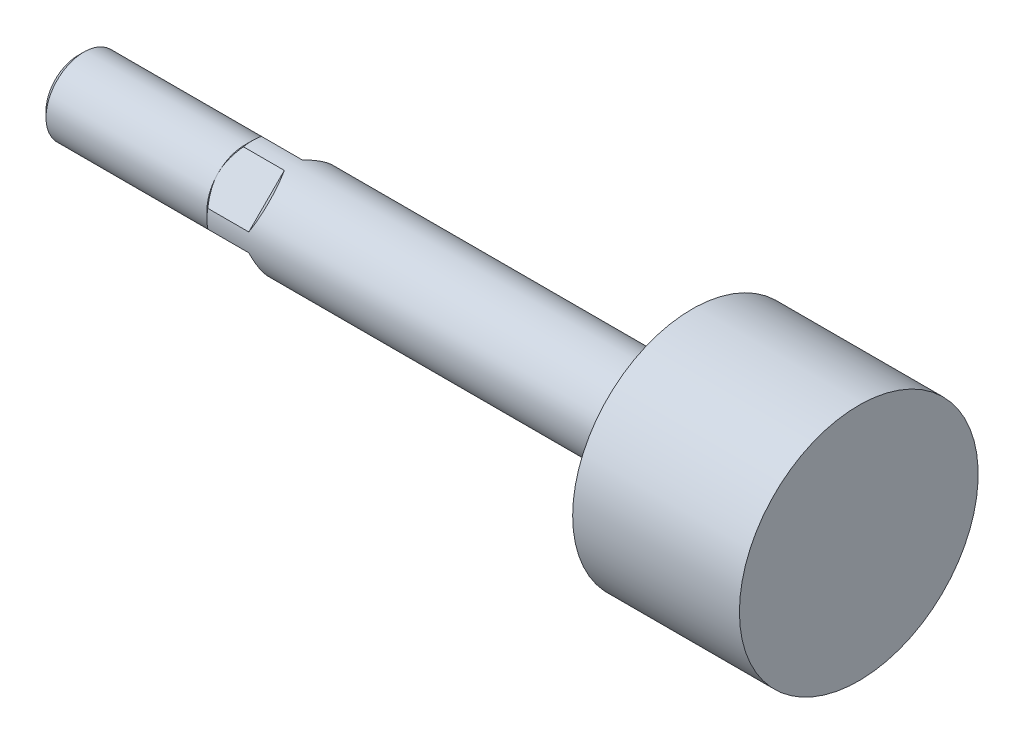
ISO-10303-21;
HEADER;
FILE_DESCRIPTION(('STEP AP214'),'2;1');
FILE_NAME('part.step','',(''),(''),'','','');
FILE_SCHEMA(('AUTOMOTIVE_DESIGN { 1 0 10303 214 1 1 1 1 }'));
ENDSEC;
DATA;
#1=APPLICATION_CONTEXT('core data for automotive mechanical design processes');
#2=APPLICATION_PROTOCOL_DEFINITION('international standard','automotive_design',2000,#1);
#3=PRODUCT_CONTEXT('',#1,'mechanical');
#4=PRODUCT('Part','Part','',(#3));
#5=PRODUCT_RELATED_PRODUCT_CATEGORY('part','',(#4));
#6=PRODUCT_DEFINITION_FORMATION('','',#4);
#7=PRODUCT_DEFINITION_CONTEXT('part definition',#1,'design');
#8=PRODUCT_DEFINITION('design','',#6,#7);
#9=PRODUCT_DEFINITION_SHAPE('','',#8);
#10=(LENGTH_UNIT() NAMED_UNIT(*) SI_UNIT(.MILLI.,.METRE.));
#11=(NAMED_UNIT(*) PLANE_ANGLE_UNIT() SI_UNIT($,.RADIAN.));
#12=(NAMED_UNIT(*) SI_UNIT($,.STERADIAN.) SOLID_ANGLE_UNIT());
#13=UNCERTAINTY_MEASURE_WITH_UNIT(LENGTH_MEASURE(1.E-05),#10,'distance_accuracy_value','');
#14=(GEOMETRIC_REPRESENTATION_CONTEXT(3) GLOBAL_UNCERTAINTY_ASSIGNED_CONTEXT((#13)) GLOBAL_UNIT_ASSIGNED_CONTEXT((#10,
#11,#12)) REPRESENTATION_CONTEXT('',''));
#15=CARTESIAN_POINT('',(0.,0.,0.));
#16=DIRECTION('',(0.,0.,1.));
#17=DIRECTION('',(1.,0.,0.));
#18=AXIS2_PLACEMENT_3D('',#15,#16,#17);
#19=CARTESIAN_POINT('',(23.,0.,0.));
#20=DIRECTION('',(1.,0.,0.));
#21=DIRECTION('',(0.,0.,-1.));
#22=AXIS2_PLACEMENT_3D('',#19,#20,#21);
#23=CONICAL_SURFACE('',#22,5.99999999999999,0.785398163397458);
#24=CARTESIAN_POINT('',(23.,0.,0.));
#25=DIRECTION('',(-1.,0.,0.));
#26=DIRECTION('',(0.,0.,1.));
#27=AXIS2_PLACEMENT_3D('',#24,#25,#26);
#28=CIRCLE('',#27,5.99999999999999);
#29=CARTESIAN_POINT('',(23.,-5.88074178584445,-1.19032602602103));
#30=VERTEX_POINT('',#29);
#31=CARTESIAN_POINT('',(23.,-5.88074178584444,1.19032602602103));
#32=VERTEX_POINT('',#31);
#33=EDGE_CURVE('E207',#30,#32,#28,.T.);
#34=ORIENTED_EDGE('',*,*,#33,.T.);
#35=CARTESIAN_POINT('',(23.0002,-5.88099761701418,1.19007019485129));
#36=CARTESIAN_POINT('',(22.9510440724068,-5.81811483877079,1.25295297309469));
#37=CARTESIAN_POINT('',(22.9029313524006,-5.75482507418753,1.31624273767794));
#38=CARTESIAN_POINT('',(22.8090823894487,-5.62734850641512,1.44371930545036));
#39=CARTESIAN_POINT('',(22.7633468355185,-5.56316144991377,1.5079063619517));
#40=CARTESIAN_POINT('',(22.6298425181198,-5.36868839423571,1.70237941762976));
#41=CARTESIAN_POINT('',(22.5461580251507,-5.23697199461111,1.83409581725437));
#42=CARTESIAN_POINT('',(22.3921031533509,-4.96822727016497,2.10284054170051));
#43=CARTESIAN_POINT('',(22.3218635701848,-4.83116098734402,2.23990682452145));
#44=CARTESIAN_POINT('',(22.1996463430324,-4.55314819356123,2.51791961830425));
#45=CARTESIAN_POINT('',(22.1476398226633,-4.41220820286015,2.65885960900533));
#46=CARTESIAN_POINT('',(22.076734746217,-4.16562053549284,2.90544727637264));
#47=CARTESIAN_POINT('',(22.0526890191447,-4.06071275132042,3.01035506054505));
#48=CARTESIAN_POINT('',(22.0175298585743,-3.84979184907852,3.22127596278696));
#49=CARTESIAN_POINT('',(22.0064169654416,-3.74377868501026,3.32728912685522));
#50=CARTESIAN_POINT('',(21.9977783521526,-3.53213647013348,3.53893134173199));
#51=CARTESIAN_POINT('',(22.0001680259723,-3.42650916818225,3.64455864368323));
#52=CARTESIAN_POINT('',(22.0181960610271,-3.21582855252728,3.8552392593382));
#53=CARTESIAN_POINT('',(22.0338352417217,-3.11077527473044,3.96029253713504));
#54=CARTESIAN_POINT('',(22.0830231598923,-2.87582236565571,4.19524544620977));
#55=CARTESIAN_POINT('',(22.1200764012196,-2.74628952530564,4.32477828655983));
#56=CARTESIAN_POINT('',(22.2110065453868,-2.49021090718472,4.58085690468076));
#57=CARTESIAN_POINT('',(22.2648923193015,-2.36366674241754,4.70740106944794));
#58=CARTESIAN_POINT('',(22.3867857329961,-2.11334572452877,4.9577220873367));
#59=CARTESIAN_POINT('',(22.454864970523,-1.98958656921088,5.0814812426546));
#60=CARTESIAN_POINT('',(22.6021483972449,-1.7454997819655,5.32556802989997));
#61=CARTESIAN_POINT('',(22.6813495208956,-1.6251712154168,5.44589659644868));
#62=CARTESIAN_POINT('',(22.8025857634106,-1.45295236100177,5.6181154508637));
#63=CARTESIAN_POINT('',(22.8411147424625,-1.39980646766205,5.67126134420343));
#64=CARTESIAN_POINT('',(22.9195954983845,-1.29437286498686,5.77669494687861));
#65=CARTESIAN_POINT('',(22.9595394195067,-1.24208223430453,5.82898557756095));
#66=CARTESIAN_POINT('',(23.0002,-1.19007019485129,5.88099761701419));
#67=B_SPLINE_CURVE_WITH_KNOTS('',3,(#35,#36,#37,#38,#39,#40,#41,#42,#43,#44,#45,#46,#47,#48,#49,
#50,#51,#52,#53,#54,#55,#56,#57,#58,#59,#60,#61,#62,#63,#64,#65,#66),.UNSPECIFIED.,.F.,.F.,(4,2,
2,2,2,2,2,2,2,2,2,2,2,2,2,4),(0.,0.304819578685166,0.609727021412003,1.22188083188484,
1.83971682595722,2.45656986235398,2.90695888785135,3.357366731032,3.80495549641768,
4.25257194643119,4.81229509723291,5.37231373221722,5.9352288198634,6.49798905371385,
6.75135396448936,7.0034831658224),.UNSPECIFIED.);
#68=CARTESIAN_POINT('',(22.,-3.53553390593274,3.53553390593274));
#69=VERTEX_POINT('',#68);
#70=EDGE_CURVE('E245',#32,#69,#67,.T.);
#71=ORIENTED_EDGE('',*,*,#70,.T.);
#72=CARTESIAN_POINT('',(22.,0.,0.));
#73=DIRECTION('',(-1.,0.,0.));
#74=DIRECTION('',(0.,0.,1.));
#75=AXIS2_PLACEMENT_3D('',#72,#73,#74);
#76=CIRCLE('',#75,5.);
#77=CARTESIAN_POINT('',(22.,-3.53553390593274,-3.53553390593274));
#78=VERTEX_POINT('',#77);
#79=EDGE_CURVE('E216',#78,#69,#76,.T.);
#80=ORIENTED_EDGE('',*,*,#79,.F.);
#81=CARTESIAN_POINT('',(23.0002,-1.19007019485129,-5.88099761701418));
#82=CARTESIAN_POINT('',(22.9510440724068,-1.25295297309469,-5.81811483877079));
#83=CARTESIAN_POINT('',(22.9029313524006,-1.31624273767794,-5.75482507418753));
#84=CARTESIAN_POINT('',(22.8090823894487,-1.44371930545036,-5.62734850641512));
#85=CARTESIAN_POINT('',(22.7633468355185,-1.5079063619517,-5.56316144991377));
#86=CARTESIAN_POINT('',(22.6298425181198,-1.70237941762976,-5.36868839423571));
#87=CARTESIAN_POINT('',(22.5461580251507,-1.83409581725436,-5.23697199461111));
#88=CARTESIAN_POINT('',(22.3921031533509,-2.10284054170051,-4.96822727016497));
#89=CARTESIAN_POINT('',(22.3218635701847,-2.23990682452145,-4.83116098734402));
#90=CARTESIAN_POINT('',(22.1996463430324,-2.51791961830425,-4.55314819356123));
#91=CARTESIAN_POINT('',(22.1476398226633,-2.65885960900533,-4.41220820286015));
#92=CARTESIAN_POINT('',(22.076734746217,-2.90544727637264,-4.16562053549284));
#93=CARTESIAN_POINT('',(22.0526890191447,-3.01035506054505,-4.06071275132043));
#94=CARTESIAN_POINT('',(22.0175298585743,-3.22127596278695,-3.84979184907852));
#95=CARTESIAN_POINT('',(22.0064169654416,-3.32728912685522,-3.74377868501026));
#96=CARTESIAN_POINT('',(21.9977783521526,-3.53893134173199,-3.53213647013349));
#97=CARTESIAN_POINT('',(22.0001680259723,-3.64455864368322,-3.42650916818225));
#98=CARTESIAN_POINT('',(22.0181960610271,-3.8552392593382,-3.21582855252728));
#99=CARTESIAN_POINT('',(22.0338352417217,-3.96029253713504,-3.11077527473044));
#100=CARTESIAN_POINT('',(22.0830231598923,-4.19524544620977,-2.87582236565571));
#101=CARTESIAN_POINT('',(22.1200764012196,-4.32477828655983,-2.74628952530564));
#102=CARTESIAN_POINT('',(22.2110065453868,-4.58085690468076,-2.49021090718472));
#103=CARTESIAN_POINT('',(22.2648923193015,-4.70740106944794,-2.36366674241754));
#104=CARTESIAN_POINT('',(22.3867857329961,-4.9577220873367,-2.11334572452877));
#105=CARTESIAN_POINT('',(22.454864970523,-5.0814812426546,-1.98958656921088));
#106=CARTESIAN_POINT('',(22.6021483972449,-5.32556802989997,-1.7454997819655));
#107=CARTESIAN_POINT('',(22.6813495208956,-5.44589659644868,-1.6251712154168));
#108=CARTESIAN_POINT('',(22.8025857634106,-5.6181154508637,-1.45295236100178));
#109=CARTESIAN_POINT('',(22.8411147424625,-5.67126134420342,-1.39980646766205));
#110=CARTESIAN_POINT('',(22.9195954983845,-5.77669494687861,-1.29437286498686));
#111=CARTESIAN_POINT('',(22.9595394195067,-5.82898557756095,-1.24208223430453));
#112=CARTESIAN_POINT('',(23.0002,-5.88099761701419,-1.19007019485129));
#113=B_SPLINE_CURVE_WITH_KNOTS('',3,(#81,#82,#83,#84,#85,#86,#87,#88,#89,#90,#91,#92,#93,#94,
#95,#96,#97,#98,#99,#100,#101,#102,#103,#104,#105,#106,#107,#108,#109,#110,#111,#112),
.UNSPECIFIED.,.F.,.F.,(4,2,2,2,2,2,2,2,2,2,2,2,2,2,2,4),(0.,0.304819578685169,0.609727021412003,
1.22188083188484,1.83971682595722,2.45656986235398,2.90695888785135,3.357366731032,
3.80495549641768,4.25257194643118,4.81229509723291,5.37231373221722,5.9352288198634,
6.49798905371385,6.75135396448936,7.0034831658224),.UNSPECIFIED.);
#114=EDGE_CURVE('E192',#78,#30,#113,.T.);
#115=ORIENTED_EDGE('',*,*,#114,.T.);
#116=EDGE_LOOP('',(#34,#71,#80,#115));
#117=FACE_BOUND('',#116,.T.);
#118=ADVANCED_FACE('F37',(#117),#23,.T.);
#119=CARTESIAN_POINT('',(23.,5.88074178584445,1.19032602602103));
#120=VERTEX_POINT('',#119);
#121=CARTESIAN_POINT('',(23.,5.88074178584444,-1.19032602602103));
#122=VERTEX_POINT('',#121);
#123=EDGE_CURVE('E209',#120,#122,#28,.T.);
#124=ORIENTED_EDGE('',*,*,#123,.T.);
#125=CARTESIAN_POINT('',(23.0002,5.88099761701418,-1.19007019485129));
#126=CARTESIAN_POINT('',(22.9510440724068,5.81811483877079,-1.25295297309469));
#127=CARTESIAN_POINT('',(22.9029313524006,5.75482507418753,-1.31624273767794));
#128=CARTESIAN_POINT('',(22.8090823894487,5.62734850641512,-1.44371930545036));
#129=CARTESIAN_POINT('',(22.7633468355185,5.56316144991377,-1.5079063619517));
#130=CARTESIAN_POINT('',(22.6298425181198,5.36868839423571,-1.70237941762976));
#131=CARTESIAN_POINT('',(22.5461580251507,5.23697199461111,-1.83409581725436));
#132=CARTESIAN_POINT('',(22.3921031533509,4.96822727016497,-2.10284054170051));
#133=CARTESIAN_POINT('',(22.3218635701847,4.83116098734402,-2.23990682452145));
#134=CARTESIAN_POINT('',(22.1996463430324,4.55314819356123,-2.51791961830425));
#135=CARTESIAN_POINT('',(22.1476398226633,4.41220820286015,-2.65885960900533));
#136=CARTESIAN_POINT('',(22.076734746217,4.16562053549284,-2.90544727637264));
#137=CARTESIAN_POINT('',(22.0526890191447,4.06071275132043,-3.01035506054505));
#138=CARTESIAN_POINT('',(22.0175298585743,3.84979184907852,-3.22127596278695));
#139=CARTESIAN_POINT('',(22.0064169654416,3.74377868501026,-3.32728912685522));
#140=CARTESIAN_POINT('',(21.9977783521526,3.53213647013348,-3.53893134173199));
#141=CARTESIAN_POINT('',(22.0001680259723,3.42650916818225,-3.64455864368322));
#142=CARTESIAN_POINT('',(22.0181960610271,3.21582855252728,-3.8552392593382));
#143=CARTESIAN_POINT('',(22.0338352417217,3.11077527473044,-3.96029253713504));
#144=CARTESIAN_POINT('',(22.0830231598923,2.87582236565571,-4.19524544620977));
#145=CARTESIAN_POINT('',(22.1200764012196,2.74628952530564,-4.32477828655983));
#146=CARTESIAN_POINT('',(22.2110065453868,2.49021090718472,-4.58085690468076));
#147=CARTESIAN_POINT('',(22.2648923193015,2.36366674241754,-4.70740106944794));
#148=CARTESIAN_POINT('',(22.3867857329961,2.11334572452877,-4.9577220873367));
#149=CARTESIAN_POINT('',(22.454864970523,1.98958656921088,-5.0814812426546));
#150=CARTESIAN_POINT('',(22.6021483972449,1.7454997819655,-5.32556802989997));
#151=CARTESIAN_POINT('',(22.6813495208956,1.6251712154168,-5.44589659644868));
#152=CARTESIAN_POINT('',(22.8025857634106,1.45295236100177,-5.6181154508637));
#153=CARTESIAN_POINT('',(22.8411147424625,1.39980646766205,-5.67126134420342));
#154=CARTESIAN_POINT('',(22.9195954983845,1.29437286498686,-5.77669494687861));
#155=CARTESIAN_POINT('',(22.9595394195067,1.24208223430453,-5.82898557756095));
#156=CARTESIAN_POINT('',(23.0002,1.19007019485129,-5.88099761701419));
#157=B_SPLINE_CURVE_WITH_KNOTS('',3,(#125,#126,#127,#128,#129,#130,#131,#132,#133,#134,#135,
#136,#137,#138,#139,#140,#141,#142,#143,#144,#145,#146,#147,#148,#149,#150,#151,#152,#153,#154,
#155,#156),.UNSPECIFIED.,.F.,.F.,(4,2,2,2,2,2,2,2,2,2,2,2,2,2,2,4),(0.,0.304819578685166,
0.609727021412002,1.22188083188484,1.83971682595722,2.45656986235398,2.90695888785135,
3.357366731032,3.80495549641768,4.25257194643118,4.81229509723291,5.37231373221722,
5.9352288198634,6.49798905371385,6.75135396448936,7.0034831658224),.UNSPECIFIED.);
#158=CARTESIAN_POINT('',(22.,3.53553390593274,-3.53553390593274));
#159=VERTEX_POINT('',#158);
#160=EDGE_CURVE('E144',#122,#159,#157,.T.);
#161=ORIENTED_EDGE('',*,*,#160,.T.);
#162=CARTESIAN_POINT('',(22.,3.53553390593274,3.53553390593274));
#163=VERTEX_POINT('',#162);
#164=EDGE_CURVE('E210',#163,#159,#76,.T.);
#165=ORIENTED_EDGE('',*,*,#164,.F.);
#166=CARTESIAN_POINT('',(23.0002,1.19007019485129,5.88099761701418));
#167=CARTESIAN_POINT('',(22.9510440724068,1.25295297309469,5.81811483877079));
#168=CARTESIAN_POINT('',(22.9029313524006,1.31624273767794,5.75482507418753));
#169=CARTESIAN_POINT('',(22.8090823894487,1.44371930545036,5.62734850641512));
#170=CARTESIAN_POINT('',(22.7633468355185,1.5079063619517,5.56316144991377));
#171=CARTESIAN_POINT('',(22.6298425181198,1.70237941762976,5.36868839423571));
#172=CARTESIAN_POINT('',(22.5461580251507,1.83409581725436,5.23697199461111));
#173=CARTESIAN_POINT('',(22.3921031533509,2.10284054170051,4.96822727016497));
#174=CARTESIAN_POINT('',(22.3218635701847,2.23990682452145,4.83116098734403));
#175=CARTESIAN_POINT('',(22.1996463430324,2.51791961830425,4.55314819356123));
#176=CARTESIAN_POINT('',(22.1476398226633,2.65885960900533,4.41220820286015));
#177=CARTESIAN_POINT('',(22.076734746217,2.90544727637264,4.16562053549284));
#178=CARTESIAN_POINT('',(22.0526890191447,3.01035506054505,4.06071275132043));
#179=CARTESIAN_POINT('',(22.0175298585743,3.22127596278695,3.84979184907852));
#180=CARTESIAN_POINT('',(22.0064169654416,3.32728912685522,3.74377868501026));
#181=CARTESIAN_POINT('',(21.9977783521526,3.53893134173199,3.53213647013349));
#182=CARTESIAN_POINT('',(22.0001680259723,3.64455864368322,3.42650916818225));
#183=CARTESIAN_POINT('',(22.0181960610271,3.8552392593382,3.21582855252728));
#184=CARTESIAN_POINT('',(22.0338352417217,3.96029253713504,3.11077527473044));
#185=CARTESIAN_POINT('',(22.0830231598923,4.19524544620977,2.87582236565571));
#186=CARTESIAN_POINT('',(22.1200764012196,4.32477828655983,2.74628952530564));
#187=CARTESIAN_POINT('',(22.2110065453868,4.58085690468076,2.49021090718472));
#188=CARTESIAN_POINT('',(22.2648923193015,4.70740106944794,2.36366674241754));
#189=CARTESIAN_POINT('',(22.3867857329961,4.9577220873367,2.11334572452878));
#190=CARTESIAN_POINT('',(22.454864970523,5.0814812426546,1.98958656921088));
#191=CARTESIAN_POINT('',(22.6021483972449,5.32556802989997,1.74549978196551));
#192=CARTESIAN_POINT('',(22.6813495208956,5.44589659644868,1.6251712154168));
#193=CARTESIAN_POINT('',(22.8025857634106,5.6181154508637,1.45295236100178));
#194=CARTESIAN_POINT('',(22.8411147424625,5.67126134420342,1.39980646766205));
#195=CARTESIAN_POINT('',(22.9195954983845,5.77669494687861,1.29437286498686));
#196=CARTESIAN_POINT('',(22.9595394195067,5.82898557756095,1.24208223430453));
#197=CARTESIAN_POINT('',(23.0002,5.88099761701419,1.19007019485129));
#198=B_SPLINE_CURVE_WITH_KNOTS('',3,(#166,#167,#168,#169,#170,#171,#172,#173,#174,#175,#176,
#177,#178,#179,#180,#181,#182,#183,#184,#185,#186,#187,#188,#189,#190,#191,#192,#193,#194,#195,
#196,#197),.UNSPECIFIED.,.F.,.F.,(4,2,2,2,2,2,2,2,2,2,2,2,2,2,2,4),(0.,0.304819578685167,
0.609727021412003,1.22188083188484,1.83971682595722,2.45656986235398,2.90695888785135,
3.357366731032,3.80495549641768,4.25257194643118,4.81229509723291,5.37231373221722,
5.9352288198634,6.49798905371385,6.75135396448936,7.0034831658224),.UNSPECIFIED.);
#199=EDGE_CURVE('E183',#163,#120,#198,.T.);
#200=ORIENTED_EDGE('',*,*,#199,.T.);
#201=EDGE_LOOP('',(#124,#161,#165,#200));
#202=FACE_BOUND('',#201,.T.);
#203=ADVANCED_FACE('F259',(#202),#23,.T.);
#204=EDGE_CURVE('E215',#69,#163,#76,.T.);
#205=ORIENTED_EDGE('',*,*,#204,.F.);
#206=CARTESIAN_POINT('',(23.,-1.19032602602103,5.88074178584445));
#207=VERTEX_POINT('',#206);
#208=EDGE_CURVE('E152',#69,#207,#67,.T.);
#209=ORIENTED_EDGE('',*,*,#208,.T.);
#210=CARTESIAN_POINT('',(23.,1.19032602602103,5.88074178584444));
#211=VERTEX_POINT('',#210);
#212=EDGE_CURVE('E206',#207,#211,#28,.T.);
#213=ORIENTED_EDGE('',*,*,#212,.T.);
#214=EDGE_CURVE('E190',#211,#163,#198,.T.);
#215=ORIENTED_EDGE('',*,*,#214,.T.);
#216=EDGE_LOOP('',(#205,#209,#213,#215));
#217=FACE_BOUND('',#216,.T.);
#218=ADVANCED_FACE('F268',(#217),#23,.T.);
#219=CARTESIAN_POINT('',(0.,0.,0.));
#220=DIRECTION('',(1.,0.,0.));
#221=DIRECTION('',(0.,0.,-1.));
#222=AXIS2_PLACEMENT_3D('',#219,#220,#221);
#223=PLANE('',#222);
#224=CARTESIAN_POINT('',(0.,0.,0.));
#225=DIRECTION('',(-1.,0.,0.));
#226=DIRECTION('',(0.,0.,1.));
#227=AXIS2_PLACEMENT_3D('',#224,#225,#226);
#228=CIRCLE('',#227,4.233);
#229=CARTESIAN_POINT('',(0.,0.,4.233));
#230=VERTEX_POINT('',#229);
#231=EDGE_CURVE('E219',#230,#230,#228,.T.);
#232=ORIENTED_EDGE('',*,*,#231,.T.);
#233=EDGE_LOOP('',(#232));
#234=FACE_BOUND('',#233,.T.);
#235=ADVANCED_FACE('F39',(#234),#223,.F.);
#236=CARTESIAN_POINT('',(0.767000000000004,0.,0.));
#237=DIRECTION('',(1.,0.,0.));
#238=DIRECTION('',(0.,0.,-1.));
#239=AXIS2_PLACEMENT_3D('',#236,#237,#238);
#240=CONICAL_SURFACE('',#239,5.,0.785398163397446);
#241=ORIENTED_EDGE('',*,*,#231,.F.);
#242=EDGE_LOOP('',(#241));
#243=FACE_BOUND('',#242,.T.);
#244=CARTESIAN_POINT('',(0.767000000000004,0.,0.));
#245=DIRECTION('',(-1.,0.,0.));
#246=DIRECTION('',(0.,0.,1.));
#247=AXIS2_PLACEMENT_3D('',#244,#245,#246);
#248=CIRCLE('',#247,5.);
#249=CARTESIAN_POINT('',(0.767000000000004,0.,5.));
#250=VERTEX_POINT('',#249);
#251=EDGE_CURVE('E213',#250,#250,#248,.T.);
#252=ORIENTED_EDGE('',*,*,#251,.T.);
#253=EDGE_LOOP('',(#252));
#254=FACE_BOUND('',#253,.T.);
#255=ADVANCED_FACE('F290',(#243,#254),#240,.T.);
#256=CARTESIAN_POINT('',(103.,0.,0.));
#257=DIRECTION('',(-1.,0.,0.));
#258=DIRECTION('',(0.,0.,1.));
#259=AXIS2_PLACEMENT_3D('',#256,#257,#258);
#260=CYLINDRICAL_SURFACE('',#259,5.);
#261=ORIENTED_EDGE('',*,*,#251,.F.);
#262=EDGE_LOOP('',(#261));
#263=FACE_BOUND('',#262,.T.);
#264=ORIENTED_EDGE('',*,*,#164,.T.);
#265=EDGE_CURVE('E214',#159,#78,#76,.T.);
#266=ORIENTED_EDGE('',*,*,#265,.T.);
#267=ORIENTED_EDGE('',*,*,#79,.T.);
#268=ORIENTED_EDGE('',*,*,#204,.T.);
#269=EDGE_LOOP('',(#264,#266,#267,#268));
#270=FACE_BOUND('',#269,.T.);
#271=ADVANCED_FACE('F267',(#263,#270),#260,.T.);
#272=ORIENTED_EDGE('',*,*,#265,.F.);
#273=CARTESIAN_POINT('',(23.,1.19032602602103,-5.88074178584445));
#274=VERTEX_POINT('',#273);
#275=EDGE_CURVE('E142',#159,#274,#157,.T.);
#276=ORIENTED_EDGE('',*,*,#275,.T.);
#277=CARTESIAN_POINT('',(23.,-1.19032602602103,-5.88074178584444));
#278=VERTEX_POINT('',#277);
#279=EDGE_CURVE('E130',#274,#278,#28,.T.);
#280=ORIENTED_EDGE('',*,*,#279,.T.);
#281=EDGE_CURVE('E191',#278,#78,#113,.T.);
#282=ORIENTED_EDGE('',*,*,#281,.T.);
#283=EDGE_LOOP('',(#272,#276,#280,#282));
#284=FACE_BOUND('',#283,.T.);
#285=ADVANCED_FACE('F158',(#284),#23,.T.);
#286=CARTESIAN_POINT('',(103.,0.,0.));
#287=DIRECTION('',(-1.,0.,0.));
#288=DIRECTION('',(0.,0.,1.));
#289=AXIS2_PLACEMENT_3D('',#286,#287,#288);
#290=CYLINDRICAL_SURFACE('',#289,6.);
#291=CARTESIAN_POINT('',(23.4,0.,0.));
#292=DIRECTION('',(0.707106781186547,0.5,-0.5));
#293=DIRECTION('',(-0.707106781186548,0.5,-0.5));
#294=AXIS2_PLACEMENT_3D('',#291,#292,#293);
#295=ELLIPSE('',#294,8.48528137423857,6.);
#296=CARTESIAN_POINT('',(28.4,-1.19032602602103,5.88074178584445));
#297=VERTEX_POINT('',#296);
#298=CARTESIAN_POINT('',(28.4,-5.88074178584445,1.19032602602103));
#299=VERTEX_POINT('',#298);
#300=EDGE_CURVE('E45',#297,#299,#295,.T.);
#301=ORIENTED_EDGE('',*,*,#300,.T.);
#302=DIRECTION('',(-1.,0.,0.));
#303=VECTOR('',#302,1.);
#304=CARTESIAN_POINT('',(103.,-5.88074178584445,1.19032602602103));
#305=LINE('',#304,#303);
#306=EDGE_CURVE('E11',#299,#32,#305,.T.);
#307=ORIENTED_EDGE('',*,*,#306,.T.);
#308=ORIENTED_EDGE('',*,*,#33,.F.);
#309=DIRECTION('',(-1.,0.,0.));
#310=VECTOR('',#309,1.);
#311=CARTESIAN_POINT('',(103.,-5.88074178584445,-1.19032602602103));
#312=LINE('',#311,#310);
#313=CARTESIAN_POINT('',(28.4,-5.88074178584444,-1.19032602602103));
#314=VERTEX_POINT('',#313);
#315=EDGE_CURVE('E225',#30,#314,#312,.F.);
#316=ORIENTED_EDGE('',*,*,#315,.T.);
#317=CARTESIAN_POINT('',(23.4,0.,0.));
#318=DIRECTION('',(0.707106781186547,0.5,0.5));
#319=DIRECTION('',(-0.707106781186548,0.5,0.5));
#320=AXIS2_PLACEMENT_3D('',#317,#318,#319);
#321=ELLIPSE('',#320,8.48528137423857,6.);
#322=CARTESIAN_POINT('',(28.4,-1.19032602602103,-5.88074178584444));
#323=VERTEX_POINT('',#322);
#324=EDGE_CURVE('E222',#314,#323,#321,.T.);
#325=ORIENTED_EDGE('',*,*,#324,.T.);
#326=DIRECTION('',(-1.,0.,0.));
#327=VECTOR('',#326,1.);
#328=CARTESIAN_POINT('',(103.,-1.19032602602103,-5.88074178584445));
#329=LINE('',#328,#327);
#330=EDGE_CURVE('E228',#323,#278,#329,.T.);
#331=ORIENTED_EDGE('',*,*,#330,.T.);
#332=ORIENTED_EDGE('',*,*,#279,.F.);
#333=DIRECTION('',(-1.,0.,0.));
#334=VECTOR('',#333,1.);
#335=CARTESIAN_POINT('',(103.,1.19032602602103,-5.88074178584445));
#336=LINE('',#335,#334);
#337=CARTESIAN_POINT('',(28.4,1.19032602602103,-5.88074178584444));
#338=VERTEX_POINT('',#337);
#339=EDGE_CURVE('E117',#274,#338,#336,.F.);
#340=ORIENTED_EDGE('',*,*,#339,.T.);
#341=CARTESIAN_POINT('',(23.4,0.,0.));
#342=DIRECTION('',(0.707106781186547,-0.5,0.5));
#343=DIRECTION('',(-0.707106781186548,-0.5,0.5));
#344=AXIS2_PLACEMENT_3D('',#341,#342,#343);
#345=ELLIPSE('',#344,8.48528137423857,6.);
#346=CARTESIAN_POINT('',(28.4,5.88074178584444,-1.19032602602103));
#347=VERTEX_POINT('',#346);
#348=EDGE_CURVE('E112',#338,#347,#345,.T.);
#349=ORIENTED_EDGE('',*,*,#348,.T.);
#350=DIRECTION('',(-1.,0.,0.));
#351=VECTOR('',#350,1.);
#352=CARTESIAN_POINT('',(103.,5.88074178584445,-1.19032602602103));
#353=LINE('',#352,#351);
#354=EDGE_CURVE('E123',#347,#122,#353,.T.);
#355=ORIENTED_EDGE('',*,*,#354,.T.);
#356=ORIENTED_EDGE('',*,*,#123,.F.);
#357=DIRECTION('',(-1.,0.,0.));
#358=VECTOR('',#357,1.);
#359=CARTESIAN_POINT('',(103.,5.88074178584445,1.19032602602103));
#360=LINE('',#359,#358);
#361=CARTESIAN_POINT('',(28.4,5.88074178584445,1.19032602602103));
#362=VERTEX_POINT('',#361);
#363=EDGE_CURVE('E230',#120,#362,#360,.F.);
#364=ORIENTED_EDGE('',*,*,#363,.T.);
#365=CARTESIAN_POINT('',(23.4,0.,0.));
#366=DIRECTION('',(0.707106781186547,-0.5,-0.5));
#367=DIRECTION('',(-0.707106781186548,-0.5,-0.5));
#368=AXIS2_PLACEMENT_3D('',#365,#366,#367);
#369=ELLIPSE('',#368,8.48528137423857,6.);
#370=CARTESIAN_POINT('',(28.4,1.19032602602103,5.88074178584445));
#371=VERTEX_POINT('',#370);
#372=EDGE_CURVE('E233',#362,#371,#369,.T.);
#373=ORIENTED_EDGE('',*,*,#372,.T.);
#374=DIRECTION('',(-1.,0.,0.));
#375=VECTOR('',#374,1.);
#376=CARTESIAN_POINT('',(103.,1.19032602602103,5.88074178584445));
#377=LINE('',#376,#375);
#378=EDGE_CURVE('E118',#371,#211,#377,.T.);
#379=ORIENTED_EDGE('',*,*,#378,.T.);
#380=ORIENTED_EDGE('',*,*,#212,.F.);
#381=DIRECTION('',(-1.,0.,0.));
#382=VECTOR('',#381,1.);
#383=CARTESIAN_POINT('',(103.,-1.19032602602103,5.88074178584445));
#384=LINE('',#383,#382);
#385=EDGE_CURVE('E132',#207,#297,#384,.F.);
#386=ORIENTED_EDGE('',*,*,#385,.T.);
#387=EDGE_LOOP('',(#301,#307,#308,#316,#325,#331,#332,#340,#349,#355,#356,#364,#373,#379,#380,#386));
#388=FACE_BOUND('',#387,.T.);
#389=CARTESIAN_POINT('',(81.,0.,0.));
#390=DIRECTION('',(-1.,0.,0.));
#391=DIRECTION('',(0.,0.,1.));
#392=AXIS2_PLACEMENT_3D('',#389,#390,#391);
#393=CIRCLE('',#392,6.);
#394=CARTESIAN_POINT('',(81.,0.,6.));
#395=VERTEX_POINT('',#394);
#396=EDGE_CURVE('E203',#395,#395,#393,.T.);
#397=ORIENTED_EDGE('',*,*,#396,.T.);
#398=EDGE_LOOP('',(#397));
#399=FACE_BOUND('',#398,.T.);
#400=ADVANCED_FACE('F127',(#388,#399),#290,.T.);
#401=CARTESIAN_POINT('',(81.,6.,0.));
#402=DIRECTION('',(1.,0.,0.));
#403=DIRECTION('',(0.,0.,-1.));
#404=AXIS2_PLACEMENT_3D('',#401,#402,#403);
#405=PLANE('',#404);
#406=ORIENTED_EDGE('',*,*,#396,.F.);
#407=EDGE_LOOP('',(#406));
#408=FACE_BOUND('',#407,.T.);
#409=CARTESIAN_POINT('',(81.,0.,0.));
#410=DIRECTION('',(-1.,0.,0.));
#411=DIRECTION('',(0.,0.,1.));
#412=AXIS2_PLACEMENT_3D('',#409,#410,#411);
#413=CIRCLE('',#412,15.75);
#414=CARTESIAN_POINT('',(81.,0.,15.75));
#415=VERTEX_POINT('',#414);
#416=EDGE_CURVE('E200',#415,#415,#413,.T.);
#417=ORIENTED_EDGE('',*,*,#416,.T.);
#418=EDGE_LOOP('',(#417));
#419=FACE_BOUND('',#418,.T.);
#420=ADVANCED_FACE('F289',(#408,#419),#405,.F.);
#421=CARTESIAN_POINT('',(103.,0.,0.));
#422=DIRECTION('',(-1.,0.,0.));
#423=DIRECTION('',(0.,0.,1.));
#424=AXIS2_PLACEMENT_3D('',#421,#422,#423);
#425=CYLINDRICAL_SURFACE('',#424,15.75);
#426=ORIENTED_EDGE('',*,*,#416,.F.);
#427=EDGE_LOOP('',(#426));
#428=FACE_BOUND('',#427,.T.);
#429=CARTESIAN_POINT('',(103.,0.,0.));
#430=DIRECTION('',(-1.,0.,0.));
#431=DIRECTION('',(0.,0.,1.));
#432=AXIS2_PLACEMENT_3D('',#429,#430,#431);
#433=CIRCLE('',#432,15.75);
#434=CARTESIAN_POINT('',(103.,0.,15.75));
#435=VERTEX_POINT('',#434);
#436=EDGE_CURVE('E197',#435,#435,#433,.T.);
#437=ORIENTED_EDGE('',*,*,#436,.T.);
#438=EDGE_LOOP('',(#437));
#439=FACE_BOUND('',#438,.T.);
#440=ADVANCED_FACE('F277',(#428,#439),#425,.T.);
#441=CARTESIAN_POINT('',(103.,15.75,0.));
#442=DIRECTION('',(-1.,0.,0.));
#443=DIRECTION('',(0.,0.,1.));
#444=AXIS2_PLACEMENT_3D('',#441,#442,#443);
#445=PLANE('',#444);
#446=ORIENTED_EDGE('',*,*,#436,.F.);
#447=EDGE_LOOP('',(#446));
#448=FACE_BOUND('',#447,.T.);
#449=ADVANCED_FACE('F272',(#448),#445,.F.);
#450=CARTESIAN_POINT('',(35.4,-4.94974746830583,-12.0208152801713));
#451=DIRECTION('',(0.707106781186547,0.5,0.5));
#452=DIRECTION('',(0.577350269189626,0.,-0.816496580927726));
#453=AXIS2_PLACEMENT_3D('',#450,#451,#452);
#454=PLANE('',#453);
#455=DIRECTION('',(0.,-0.707106781186548,0.707106781186547));
#456=VECTOR('',#455,1.);
#457=CARTESIAN_POINT('',(28.4,0.,-7.07106781186548));
#458=LINE('',#457,#456);
#459=EDGE_CURVE('E242',#323,#314,#458,.T.);
#460=ORIENTED_EDGE('',*,*,#459,.F.);
#461=ORIENTED_EDGE('',*,*,#324,.F.);
#462=EDGE_LOOP('',(#460,#461));
#463=FACE_BOUND('',#462,.T.);
#464=ADVANCED_FACE('F270',(#463),#454,.F.);
#465=CARTESIAN_POINT('',(28.4,0.,-7.07106781186548));
#466=DIRECTION('',(0.,0.707106781186547,0.707106781186548));
#467=DIRECTION('',(0.,-0.707106781186548,0.707106781186547));
#468=AXIS2_PLACEMENT_3D('',#465,#466,#467);
#469=PLANE('',#468);
#470=ORIENTED_EDGE('',*,*,#459,.T.);
#471=ORIENTED_EDGE('',*,*,#315,.F.);
#472=ORIENTED_EDGE('',*,*,#114,.F.);
#473=ORIENTED_EDGE('',*,*,#281,.F.);
#474=ORIENTED_EDGE('',*,*,#330,.F.);
#475=EDGE_LOOP('',(#470,#471,#472,#473,#474));
#476=FACE_BOUND('',#475,.T.);
#477=ADVANCED_FACE('F174',(#476),#469,.F.);
#478=CARTESIAN_POINT('',(28.4,7.07106781186548,0.));
#479=DIRECTION('',(0.707106781186547,-0.5,-0.5));
#480=DIRECTION('',(-0.577350269189626,0.,-0.816496580927726));
#481=AXIS2_PLACEMENT_3D('',#478,#479,#480);
#482=PLANE('',#481);
#483=DIRECTION('',(0.,-0.707106781186548,0.707106781186547));
#484=VECTOR('',#483,1.);
#485=CARTESIAN_POINT('',(28.4,7.07106781186548,0.));
#486=LINE('',#485,#484);
#487=EDGE_CURVE('E239',#362,#371,#486,.T.);
#488=ORIENTED_EDGE('',*,*,#487,.T.);
#489=ORIENTED_EDGE('',*,*,#372,.F.);
#490=EDGE_LOOP('',(#488,#489));
#491=FACE_BOUND('',#490,.T.);
#492=ADVANCED_FACE('F171',(#491),#482,.F.);
#493=CARTESIAN_POINT('',(22.,7.07106781186548,0.));
#494=DIRECTION('',(0.,-0.707106781186547,-0.707106781186548));
#495=DIRECTION('',(0.,0.707106781186548,-0.707106781186547));
#496=AXIS2_PLACEMENT_3D('',#493,#494,#495);
#497=PLANE('',#496);
#498=ORIENTED_EDGE('',*,*,#487,.F.);
#499=ORIENTED_EDGE('',*,*,#363,.F.);
#500=ORIENTED_EDGE('',*,*,#199,.F.);
#501=ORIENTED_EDGE('',*,*,#214,.F.);
#502=ORIENTED_EDGE('',*,*,#378,.F.);
#503=EDGE_LOOP('',(#498,#499,#500,#501,#502));
#504=FACE_BOUND('',#503,.T.);
#505=ADVANCED_FACE('F170',(#504),#497,.F.);
#506=CARTESIAN_POINT('',(35.4,12.0208152801713,-4.94974746830584));
#507=DIRECTION('',(0.707106781186547,-0.5,0.5));
#508=DIRECTION('',(0.577350269189626,0.,-0.816496580927726));
#509=AXIS2_PLACEMENT_3D('',#506,#507,#508);
#510=PLANE('',#509);
#511=DIRECTION('',(0.,-0.707106781186548,-0.707106781186547));
#512=VECTOR('',#511,1.);
#513=CARTESIAN_POINT('',(28.4,7.07106781186548,0.));
#514=LINE('',#513,#512);
#515=EDGE_CURVE('E59',#347,#338,#514,.T.);
#516=ORIENTED_EDGE('',*,*,#515,.F.);
#517=ORIENTED_EDGE('',*,*,#348,.F.);
#518=EDGE_LOOP('',(#516,#517));
#519=FACE_BOUND('',#518,.T.);
#520=ADVANCED_FACE('F113',(#519),#510,.F.);
#521=CARTESIAN_POINT('',(28.4,7.07106781186548,0.));
#522=DIRECTION('',(0.,-0.707106781186547,0.707106781186548));
#523=DIRECTION('',(0.,-0.707106781186548,-0.707106781186547));
#524=AXIS2_PLACEMENT_3D('',#521,#522,#523);
#525=PLANE('',#524);
#526=ORIENTED_EDGE('',*,*,#515,.T.);
#527=ORIENTED_EDGE('',*,*,#339,.F.);
#528=ORIENTED_EDGE('',*,*,#275,.F.);
#529=ORIENTED_EDGE('',*,*,#160,.F.);
#530=ORIENTED_EDGE('',*,*,#354,.F.);
#531=EDGE_LOOP('',(#526,#527,#528,#529,#530));
#532=FACE_BOUND('',#531,.T.);
#533=ADVANCED_FACE('F121',(#532),#525,.F.);
#534=CARTESIAN_POINT('',(28.4,0.,7.07106781186548));
#535=DIRECTION('',(0.707106781186547,0.5,-0.5));
#536=DIRECTION('',(-0.577350269189626,0.,-0.816496580927726));
#537=AXIS2_PLACEMENT_3D('',#534,#535,#536);
#538=PLANE('',#537);
#539=DIRECTION('',(0.,-0.707106781186548,-0.707106781186547));
#540=VECTOR('',#539,1.);
#541=CARTESIAN_POINT('',(28.4,0.,7.07106781186548));
#542=LINE('',#541,#540);
#543=EDGE_CURVE('E52',#297,#299,#542,.T.);
#544=ORIENTED_EDGE('',*,*,#543,.T.);
#545=ORIENTED_EDGE('',*,*,#300,.F.);
#546=EDGE_LOOP('',(#544,#545));
#547=FACE_BOUND('',#546,.T.);
#548=ADVANCED_FACE('F141',(#547),#538,.F.);
#549=CARTESIAN_POINT('',(22.,0.,7.07106781186548));
#550=DIRECTION('',(0.,0.707106781186547,-0.707106781186548));
#551=DIRECTION('',(0.,0.707106781186548,0.707106781186547));
#552=AXIS2_PLACEMENT_3D('',#549,#550,#551);
#553=PLANE('',#552);
#554=ORIENTED_EDGE('',*,*,#543,.F.);
#555=ORIENTED_EDGE('',*,*,#385,.F.);
#556=ORIENTED_EDGE('',*,*,#208,.F.);
#557=ORIENTED_EDGE('',*,*,#70,.F.);
#558=ORIENTED_EDGE('',*,*,#306,.F.);
#559=EDGE_LOOP('',(#554,#555,#556,#557,#558));
#560=FACE_BOUND('',#559,.T.);
#561=ADVANCED_FACE('F165',(#560),#553,.F.);
#562=CLOSED_SHELL('',(#118,#203,#218,#235,#255,#271,#285,#400,#420,#440,#449,#464,#477,#492,
#505,#520,#533,#548,#561));
#563=MANIFOLD_SOLID_BREP('B2',#562);
#564=ADVANCED_BREP_SHAPE_REPRESENTATION('',(#18,#563),#14);
#565=SHAPE_DEFINITION_REPRESENTATION(#9,#564);
ENDSEC;
END-ISO-10303-21;
